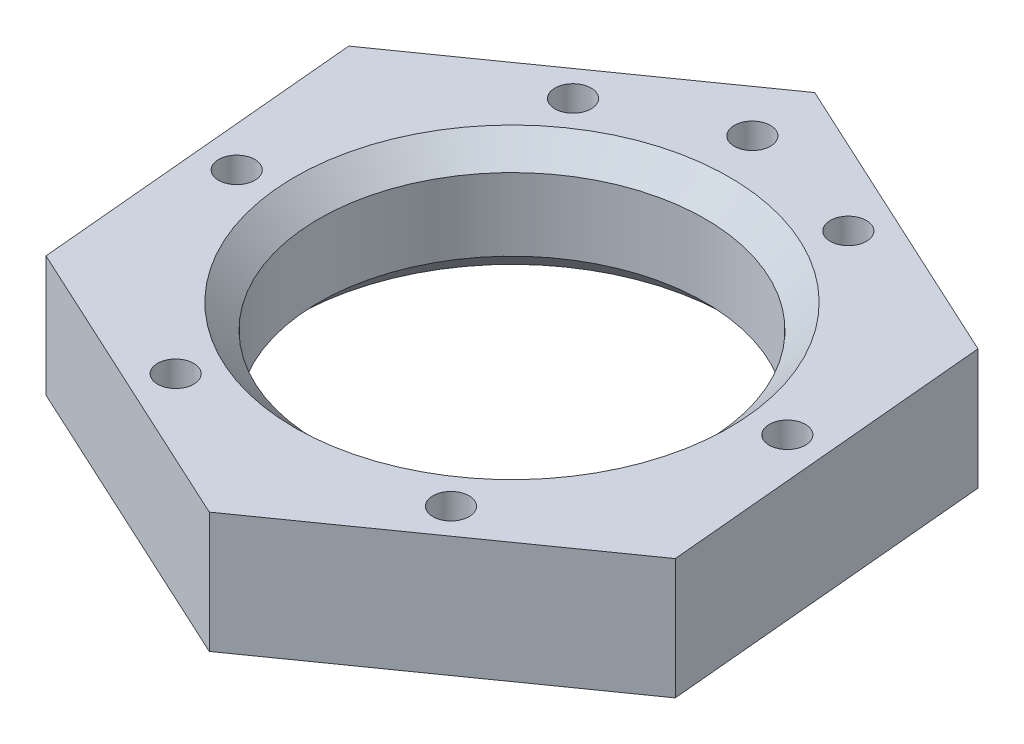
ISO-10303-21;
HEADER;
FILE_DESCRIPTION(('STEP AP214'),'2;1');
FILE_NAME('part.step','',(''),(''),'','','');
FILE_SCHEMA(('AUTOMOTIVE_DESIGN { 1 0 10303 214 1 1 1 1 }'));
ENDSEC;
DATA;
#1=APPLICATION_CONTEXT('core data for automotive mechanical design processes');
#2=APPLICATION_PROTOCOL_DEFINITION('international standard','automotive_design',2000,#1);
#3=PRODUCT_CONTEXT('',#1,'mechanical');
#4=PRODUCT('Part','Part','',(#3));
#5=PRODUCT_RELATED_PRODUCT_CATEGORY('part','',(#4));
#6=PRODUCT_DEFINITION_FORMATION('','',#4);
#7=PRODUCT_DEFINITION_CONTEXT('part definition',#1,'design');
#8=PRODUCT_DEFINITION('design','',#6,#7);
#9=PRODUCT_DEFINITION_SHAPE('','',#8);
#10=(LENGTH_UNIT() NAMED_UNIT(*) SI_UNIT(.MILLI.,.METRE.));
#11=(NAMED_UNIT(*) PLANE_ANGLE_UNIT() SI_UNIT($,.RADIAN.));
#12=(NAMED_UNIT(*) SI_UNIT($,.STERADIAN.) SOLID_ANGLE_UNIT());
#13=UNCERTAINTY_MEASURE_WITH_UNIT(LENGTH_MEASURE(1.E-05),#10,'distance_accuracy_value','');
#14=(GEOMETRIC_REPRESENTATION_CONTEXT(3) GLOBAL_UNCERTAINTY_ASSIGNED_CONTEXT((#13)) GLOBAL_UNIT_ASSIGNED_CONTEXT((#10,
#11,#12)) REPRESENTATION_CONTEXT('',''));
#15=CARTESIAN_POINT('',(0.,0.,0.));
#16=DIRECTION('',(0.,0.,1.));
#17=DIRECTION('',(1.,0.,0.));
#18=AXIS2_PLACEMENT_3D('',#15,#16,#17);
#19=CARTESIAN_POINT('',(-14.3804089631958,6.35,10.1430093192917));
#20=DIRECTION('',(0.419504911530997,0.,-0.907753066203233));
#21=DIRECTION('',(-0.907753066203233,0.,-0.419504911530997));
#22=AXIS2_PLACEMENT_3D('',#19,#20,#21);
#23=PLANE('',#22);
#24=DIRECTION('',(0.907753066203232,0.,0.419504911530997));
#25=VECTOR('',#24,1.);
#26=CARTESIAN_POINT('',(-14.3804089631958,0.,10.1430093192917));
#27=LINE('',#26,#25);
#28=CARTESIAN_POINT('',(-14.3804089631958,0.,10.1430093192917));
#29=VERTEX_POINT('',#28);
#30=CARTESIAN_POINT('',(1.59389925973101,0.,17.5253041385828));
#31=VERTEX_POINT('',#30);
#32=EDGE_CURVE('E119',#29,#31,#27,.T.);
#33=ORIENTED_EDGE('',*,*,#32,.T.);
#34=DIRECTION('',(0.,-1.,0.));
#35=VECTOR('',#34,1.);
#36=CARTESIAN_POINT('',(1.59389925973101,6.35,17.5253041385828));
#37=LINE('',#36,#35);
#38=CARTESIAN_POINT('',(1.59389925973101,6.35,17.5253041385828));
#39=VERTEX_POINT('',#38);
#40=EDGE_CURVE('E137',#39,#31,#37,.T.);
#41=ORIENTED_EDGE('',*,*,#40,.F.);
#42=DIRECTION('',(0.907753066203232,0.,0.419504911530997));
#43=VECTOR('',#42,1.);
#44=CARTESIAN_POINT('',(-14.3804089631958,6.35,10.1430093192917));
#45=LINE('',#44,#43);
#46=CARTESIAN_POINT('',(-14.3804089631958,6.35,10.1430093192917));
#47=VERTEX_POINT('',#46);
#48=EDGE_CURVE('E130',#47,#39,#45,.T.);
#49=ORIENTED_EDGE('',*,*,#48,.F.);
#50=DIRECTION('',(0.,-1.,0.));
#51=VECTOR('',#50,1.);
#52=CARTESIAN_POINT('',(-14.3804089631958,6.35,10.1430093192917));
#53=LINE('',#52,#51);
#54=EDGE_CURVE('E115',#47,#29,#53,.T.);
#55=ORIENTED_EDGE('',*,*,#54,.T.);
#56=EDGE_LOOP('',(#33,#41,#49,#55));
#57=FACE_BOUND('',#56,.T.);
#58=ADVANCED_FACE('F33',(#57),#23,.F.);
#59=CARTESIAN_POINT('',(1.59389925973101,6.35,17.5253041385828));
#60=DIRECTION('',(-0.576384759929718,0.,-0.817178443499803));
#61=DIRECTION('',(-0.817178443499803,0.,0.576384759929718));
#62=AXIS2_PLACEMENT_3D('',#59,#60,#61);
#63=PLANE('',#62);
#64=DIRECTION('',(0.817178443499803,0.,-0.576384759929718));
#65=VECTOR('',#64,1.);
#66=CARTESIAN_POINT('',(1.59389925973101,0.,17.5253041385828));
#67=LINE('',#66,#65);
#68=CARTESIAN_POINT('',(15.9743082229268,0.,7.38229481929115));
#69=VERTEX_POINT('',#68);
#70=EDGE_CURVE('E122',#31,#69,#67,.T.);
#71=ORIENTED_EDGE('',*,*,#70,.T.);
#72=DIRECTION('',(0.,-1.,0.));
#73=VECTOR('',#72,1.);
#74=CARTESIAN_POINT('',(15.9743082229268,6.35,7.38229481929115));
#75=LINE('',#74,#73);
#76=CARTESIAN_POINT('',(15.9743082229268,6.35,7.38229481929115));
#77=VERTEX_POINT('',#76);
#78=EDGE_CURVE('E134',#77,#69,#75,.T.);
#79=ORIENTED_EDGE('',*,*,#78,.F.);
#80=DIRECTION('',(0.817178443499803,0.,-0.576384759929718));
#81=VECTOR('',#80,1.);
#82=CARTESIAN_POINT('',(1.59389925973101,6.35,17.5253041385828));
#83=LINE('',#82,#81);
#84=EDGE_CURVE('E88',#39,#77,#83,.T.);
#85=ORIENTED_EDGE('',*,*,#84,.F.);
#86=ORIENTED_EDGE('',*,*,#40,.T.);
#87=EDGE_LOOP('',(#71,#79,#85,#86));
#88=FACE_BOUND('',#87,.T.);
#89=ADVANCED_FACE('F176',(#88),#63,.F.);
#90=CARTESIAN_POINT('',(15.9743082229268,6.35,7.38229481929115));
#91=DIRECTION('',(-0.995889671460715,0.,0.0905746227034295));
#92=DIRECTION('',(0.0905746227034295,0.,0.995889671460715));
#93=AXIS2_PLACEMENT_3D('',#90,#91,#92);
#94=PLANE('',#93);
#95=DIRECTION('',(-0.0905746227034295,0.,-0.995889671460715));
#96=VECTOR('',#95,1.);
#97=CARTESIAN_POINT('',(15.9743082229268,0.,7.38229481929115));
#98=LINE('',#97,#96);
#99=CARTESIAN_POINT('',(14.3804089631958,0.,-10.1430093192917));
#100=VERTEX_POINT('',#99);
#101=EDGE_CURVE('E125',#69,#100,#98,.T.);
#102=ORIENTED_EDGE('',*,*,#101,.T.);
#103=DIRECTION('',(0.,-1.,0.));
#104=VECTOR('',#103,1.);
#105=CARTESIAN_POINT('',(14.3804089631958,6.35,-10.1430093192917));
#106=LINE('',#105,#104);
#107=CARTESIAN_POINT('',(14.3804089631958,6.35,-10.1430093192917));
#108=VERTEX_POINT('',#107);
#109=EDGE_CURVE('E110',#108,#100,#106,.T.);
#110=ORIENTED_EDGE('',*,*,#109,.F.);
#111=DIRECTION('',(-0.0905746227034295,0.,-0.995889671460715));
#112=VECTOR('',#111,1.);
#113=CARTESIAN_POINT('',(15.9743082229268,6.35,7.38229481929115));
#114=LINE('',#113,#112);
#115=EDGE_CURVE('E101',#77,#108,#114,.T.);
#116=ORIENTED_EDGE('',*,*,#115,.F.);
#117=ORIENTED_EDGE('',*,*,#78,.T.);
#118=EDGE_LOOP('',(#102,#110,#116,#117));
#119=FACE_BOUND('',#118,.T.);
#120=ADVANCED_FACE('F181',(#119),#94,.F.);
#121=CARTESIAN_POINT('',(14.3804089631958,6.35,-10.1430093192917));
#122=DIRECTION('',(-0.419504911530997,0.,0.907753066203233));
#123=DIRECTION('',(0.907753066203233,0.,0.419504911530997));
#124=AXIS2_PLACEMENT_3D('',#121,#122,#123);
#125=PLANE('',#124);
#126=DIRECTION('',(-0.907753066203232,0.,-0.419504911530997));
#127=VECTOR('',#126,1.);
#128=CARTESIAN_POINT('',(14.3804089631958,0.,-10.1430093192917));
#129=LINE('',#128,#127);
#130=CARTESIAN_POINT('',(-1.59389925973101,0.,-17.5253041385828));
#131=VERTEX_POINT('',#130);
#132=EDGE_CURVE('E109',#100,#131,#129,.T.);
#133=ORIENTED_EDGE('',*,*,#132,.T.);
#134=DIRECTION('',(0.,-1.,0.));
#135=VECTOR('',#134,1.);
#136=CARTESIAN_POINT('',(-1.59389925973101,6.35,-17.5253041385828));
#137=LINE('',#136,#135);
#138=CARTESIAN_POINT('',(-1.59389925973101,6.35,-17.5253041385828));
#139=VERTEX_POINT('',#138);
#140=EDGE_CURVE('E106',#139,#131,#137,.T.);
#141=ORIENTED_EDGE('',*,*,#140,.F.);
#142=DIRECTION('',(-0.907753066203232,0.,-0.419504911530997));
#143=VECTOR('',#142,1.);
#144=CARTESIAN_POINT('',(14.3804089631958,6.35,-10.1430093192917));
#145=LINE('',#144,#143);
#146=EDGE_CURVE('E95',#108,#139,#145,.T.);
#147=ORIENTED_EDGE('',*,*,#146,.F.);
#148=ORIENTED_EDGE('',*,*,#109,.T.);
#149=EDGE_LOOP('',(#133,#141,#147,#148));
#150=FACE_BOUND('',#149,.T.);
#151=ADVANCED_FACE('F107',(#150),#125,.F.);
#152=CARTESIAN_POINT('',(-1.59389925973101,6.35,-17.5253041385828));
#153=DIRECTION('',(0.576384759929718,0.,0.817178443499803));
#154=DIRECTION('',(0.817178443499803,0.,-0.576384759929718));
#155=AXIS2_PLACEMENT_3D('',#152,#153,#154);
#156=PLANE('',#155);
#157=DIRECTION('',(-0.817178443499803,0.,0.576384759929718));
#158=VECTOR('',#157,1.);
#159=CARTESIAN_POINT('',(-1.59389925973101,0.,-17.5253041385828));
#160=LINE('',#159,#158);
#161=CARTESIAN_POINT('',(-15.9743082229268,0.,-7.38229481929115));
#162=VERTEX_POINT('',#161);
#163=EDGE_CURVE('E73',#131,#162,#160,.T.);
#164=ORIENTED_EDGE('',*,*,#163,.T.);
#165=DIRECTION('',(0.,-1.,0.));
#166=VECTOR('',#165,1.);
#167=CARTESIAN_POINT('',(-15.9743082229268,6.35,-7.38229481929115));
#168=LINE('',#167,#166);
#169=CARTESIAN_POINT('',(-15.9743082229268,6.35,-7.38229481929115));
#170=VERTEX_POINT('',#169);
#171=EDGE_CURVE('E111',#170,#162,#168,.T.);
#172=ORIENTED_EDGE('',*,*,#171,.F.);
#173=DIRECTION('',(-0.817178443499803,0.,0.576384759929718));
#174=VECTOR('',#173,1.);
#175=CARTESIAN_POINT('',(-1.59389925973101,6.35,-17.5253041385828));
#176=LINE('',#175,#174);
#177=EDGE_CURVE('E99',#139,#170,#176,.T.);
#178=ORIENTED_EDGE('',*,*,#177,.F.);
#179=ORIENTED_EDGE('',*,*,#140,.T.);
#180=EDGE_LOOP('',(#164,#172,#178,#179));
#181=FACE_BOUND('',#180,.T.);
#182=ADVANCED_FACE('F113',(#181),#156,.F.);
#183=CARTESIAN_POINT('',(-15.9743082229268,6.35,-7.38229481929115));
#184=DIRECTION('',(0.995889671460715,0.,-0.0905746227034294));
#185=DIRECTION('',(-0.0905746227034294,0.,-0.995889671460715));
#186=AXIS2_PLACEMENT_3D('',#183,#184,#185);
#187=PLANE('',#186);
#188=DIRECTION('',(0.0905746227034294,0.,0.995889671460715));
#189=VECTOR('',#188,1.);
#190=CARTESIAN_POINT('',(-15.9743082229268,0.,-7.38229481929115));
#191=LINE('',#190,#189);
#192=EDGE_CURVE('E79',#162,#29,#191,.T.);
#193=ORIENTED_EDGE('',*,*,#192,.T.);
#194=ORIENTED_EDGE('',*,*,#54,.F.);
#195=DIRECTION('',(0.0905746227034294,0.,0.995889671460715));
#196=VECTOR('',#195,1.);
#197=CARTESIAN_POINT('',(-15.9743082229268,6.35,-7.38229481929115));
#198=LINE('',#197,#196);
#199=EDGE_CURVE('E50',#170,#47,#198,.T.);
#200=ORIENTED_EDGE('',*,*,#199,.F.);
#201=ORIENTED_EDGE('',*,*,#171,.T.);
#202=EDGE_LOOP('',(#193,#194,#200,#201));
#203=FACE_BOUND('',#202,.T.);
#204=ADVANCED_FACE('F165',(#203),#187,.F.);
#205=CARTESIAN_POINT('',(0.,6.35,0.));
#206=DIRECTION('',(0.,1.,0.));
#207=DIRECTION('',(0.,0.,1.));
#208=AXIS2_PLACEMENT_3D('',#205,#206,#207);
#209=PLANE('',#208);
#210=CARTESIAN_POINT('',(-13.2801887689279,6.35,1.20781259375056));
#211=DIRECTION('',(0.,1.,0.));
#212=DIRECTION('',(0.,0.,1.));
#213=AXIS2_PLACEMENT_3D('',#210,#211,#212);
#214=CIRCLE('',#213,0.95250000000031);
#215=CARTESIAN_POINT('',(-13.2801887689279,6.35,2.16031259375087));
#216=VERTEX_POINT('',#215);
#217=EDGE_CURVE('E314',#216,#216,#214,.T.);
#218=ORIENTED_EDGE('',*,*,#217,.F.);
#219=EDGE_LOOP('',(#218));
#220=FACE_BOUND('',#219,.T.);
#221=CARTESIAN_POINT('',(-5.59409799526453,6.35,12.10488713782));
#222=DIRECTION('',(0.,1.,0.));
#223=DIRECTION('',(0.,0.,1.));
#224=AXIS2_PLACEMENT_3D('',#221,#222,#223);
#225=CIRCLE('',#224,0.952500000000998);
#226=CARTESIAN_POINT('',(-5.59409799526453,6.35,13.057387137821));
#227=VERTEX_POINT('',#226);
#228=EDGE_CURVE('E316',#227,#227,#225,.T.);
#229=ORIENTED_EDGE('',*,*,#228,.F.);
#230=EDGE_LOOP('',(#229));
#231=FACE_BOUND('',#230,.T.);
#232=CARTESIAN_POINT('',(7.68609077366403,6.35,10.897074544069));
#233=DIRECTION('',(0.,1.,0.));
#234=DIRECTION('',(0.,0.,1.));
#235=AXIS2_PLACEMENT_3D('',#232,#233,#234);
#236=CIRCLE('',#235,0.952500000001527);
#237=CARTESIAN_POINT('',(7.68609077366403,6.35,11.8495745440705));
#238=VERTEX_POINT('',#237);
#239=EDGE_CURVE('E322',#238,#238,#236,.T.);
#240=ORIENTED_EDGE('',*,*,#239,.F.);
#241=EDGE_LOOP('',(#240));
#242=FACE_BOUND('',#241,.T.);
#243=CARTESIAN_POINT('',(13.2801887689292,6.35,-1.20781259375142));
#244=DIRECTION('',(0.,1.,0.));
#245=DIRECTION('',(0.,0.,1.));
#246=AXIS2_PLACEMENT_3D('',#243,#244,#245);
#247=CIRCLE('',#246,0.952500000001344);
#248=CARTESIAN_POINT('',(13.2801887689292,6.35,-0.255312593750081));
#249=VERTEX_POINT('',#248);
#250=EDGE_CURVE('E328',#249,#249,#247,.T.);
#251=ORIENTED_EDGE('',*,*,#250,.F.);
#252=EDGE_LOOP('',(#251));
#253=FACE_BOUND('',#252,.T.);
#254=CARTESIAN_POINT('',(5.59409799526577,6.35,-12.1048871378209));
#255=DIRECTION('',(0.,1.,0.));
#256=DIRECTION('',(0.,0.,1.));
#257=AXIS2_PLACEMENT_3D('',#254,#255,#256);
#258=CIRCLE('',#257,0.952500000000593);
#259=CARTESIAN_POINT('',(5.59409799526577,6.35,-11.1523871378203));
#260=VERTEX_POINT('',#259);
#261=EDGE_CURVE('E334',#260,#260,#258,.T.);
#262=ORIENTED_EDGE('',*,*,#261,.F.);
#263=EDGE_LOOP('',(#262));
#264=FACE_BOUND('',#263,.T.);
#265=CARTESIAN_POINT('',(-1.26532747916691,6.35,-13.9125787103062));
#266=DIRECTION('',(0.,1.,0.));
#267=DIRECTION('',(0.,0.,1.));
#268=AXIS2_PLACEMENT_3D('',#265,#266,#267);
#269=CIRCLE('',#268,0.9525);
#270=CARTESIAN_POINT('',(-1.26532747916691,6.35,-12.9600787103062));
#271=VERTEX_POINT('',#270);
#272=EDGE_CURVE('E340',#271,#271,#269,.T.);
#273=ORIENTED_EDGE('',*,*,#272,.F.);
#274=EDGE_LOOP('',(#273));
#275=FACE_BOUND('',#274,.T.);
#276=CARTESIAN_POINT('',(-7.6860907736628,6.35,-10.8970745440699));
#277=DIRECTION('',(0.,1.,0.));
#278=DIRECTION('',(0.,0.,1.));
#279=AXIS2_PLACEMENT_3D('',#276,#277,#278);
#280=CIRCLE('',#279,0.9525);
#281=CARTESIAN_POINT('',(-7.6860907736628,6.35,-9.94457454406988));
#282=VERTEX_POINT('',#281);
#283=EDGE_CURVE('E346',#282,#282,#280,.T.);
#284=ORIENTED_EDGE('',*,*,#283,.F.);
#285=EDGE_LOOP('',(#284));
#286=FACE_BOUND('',#285,.T.);
#287=CARTESIAN_POINT('',(0.,6.35,0.));
#288=DIRECTION('',(0.,1.,0.));
#289=DIRECTION('',(0.,0.,1.));
#290=AXIS2_PLACEMENT_3D('',#287,#288,#289);
#291=CIRCLE('',#290,11.43);
#292=CARTESIAN_POINT('',(0.,6.35,11.43));
#293=VERTEX_POINT('',#292);
#294=EDGE_CURVE('E11',#293,#293,#291,.F.);
#295=ORIENTED_EDGE('',*,*,#294,.T.);
#296=EDGE_LOOP('',(#295));
#297=FACE_BOUND('',#296,.T.);
#298=ORIENTED_EDGE('',*,*,#48,.T.);
#299=ORIENTED_EDGE('',*,*,#84,.T.);
#300=ORIENTED_EDGE('',*,*,#115,.T.);
#301=ORIENTED_EDGE('',*,*,#146,.T.);
#302=ORIENTED_EDGE('',*,*,#177,.T.);
#303=ORIENTED_EDGE('',*,*,#199,.T.);
#304=EDGE_LOOP('',(#298,#299,#300,#301,#302,#303));
#305=FACE_BOUND('',#304,.T.);
#306=ADVANCED_FACE('F97',(#220,#231,#242,#253,#264,#275,#286,#297,#305),#209,.T.);
#307=CARTESIAN_POINT('',(0.,0.,0.));
#308=DIRECTION('',(0.,1.,0.));
#309=DIRECTION('',(0.,0.,1.));
#310=AXIS2_PLACEMENT_3D('',#307,#308,#309);
#311=PLANE('',#310);
#312=CARTESIAN_POINT('',(-13.2801887689279,0.,1.20781259375056));
#313=DIRECTION('',(0.,1.,0.));
#314=DIRECTION('',(0.,0.,1.));
#315=AXIS2_PLACEMENT_3D('',#312,#313,#314);
#316=CIRCLE('',#315,0.95250000000031);
#317=CARTESIAN_POINT('',(-13.2801887689279,0.,2.16031259375087));
#318=VERTEX_POINT('',#317);
#319=EDGE_CURVE('E311',#318,#318,#316,.T.);
#320=ORIENTED_EDGE('',*,*,#319,.T.);
#321=EDGE_LOOP('',(#320));
#322=FACE_BOUND('',#321,.T.);
#323=CARTESIAN_POINT('',(-5.59409799526453,0.,12.10488713782));
#324=DIRECTION('',(0.,1.,0.));
#325=DIRECTION('',(0.,0.,1.));
#326=AXIS2_PLACEMENT_3D('',#323,#324,#325);
#327=CIRCLE('',#326,0.952500000000998);
#328=CARTESIAN_POINT('',(-5.59409799526453,0.,13.057387137821));
#329=VERTEX_POINT('',#328);
#330=EDGE_CURVE('E319',#329,#329,#327,.T.);
#331=ORIENTED_EDGE('',*,*,#330,.T.);
#332=EDGE_LOOP('',(#331));
#333=FACE_BOUND('',#332,.T.);
#334=CARTESIAN_POINT('',(7.68609077366403,0.,10.897074544069));
#335=DIRECTION('',(0.,1.,0.));
#336=DIRECTION('',(0.,0.,1.));
#337=AXIS2_PLACEMENT_3D('',#334,#335,#336);
#338=CIRCLE('',#337,0.952500000001527);
#339=CARTESIAN_POINT('',(7.68609077366403,0.,11.8495745440705));
#340=VERTEX_POINT('',#339);
#341=EDGE_CURVE('E325',#340,#340,#338,.T.);
#342=ORIENTED_EDGE('',*,*,#341,.T.);
#343=EDGE_LOOP('',(#342));
#344=FACE_BOUND('',#343,.T.);
#345=CARTESIAN_POINT('',(13.2801887689292,0.,-1.20781259375142));
#346=DIRECTION('',(0.,1.,0.));
#347=DIRECTION('',(0.,0.,1.));
#348=AXIS2_PLACEMENT_3D('',#345,#346,#347);
#349=CIRCLE('',#348,0.952500000001344);
#350=CARTESIAN_POINT('',(13.2801887689292,0.,-0.255312593750081));
#351=VERTEX_POINT('',#350);
#352=EDGE_CURVE('E331',#351,#351,#349,.T.);
#353=ORIENTED_EDGE('',*,*,#352,.T.);
#354=EDGE_LOOP('',(#353));
#355=FACE_BOUND('',#354,.T.);
#356=CARTESIAN_POINT('',(5.59409799526577,0.,-12.1048871378209));
#357=DIRECTION('',(0.,1.,0.));
#358=DIRECTION('',(0.,0.,1.));
#359=AXIS2_PLACEMENT_3D('',#356,#357,#358);
#360=CIRCLE('',#359,0.952500000000593);
#361=CARTESIAN_POINT('',(5.59409799526577,0.,-11.1523871378203));
#362=VERTEX_POINT('',#361);
#363=EDGE_CURVE('E337',#362,#362,#360,.T.);
#364=ORIENTED_EDGE('',*,*,#363,.T.);
#365=EDGE_LOOP('',(#364));
#366=FACE_BOUND('',#365,.T.);
#367=CARTESIAN_POINT('',(-1.26532747916691,0.,-13.9125787103062));
#368=DIRECTION('',(0.,1.,0.));
#369=DIRECTION('',(0.,0.,1.));
#370=AXIS2_PLACEMENT_3D('',#367,#368,#369);
#371=CIRCLE('',#370,0.9525);
#372=CARTESIAN_POINT('',(-1.26532747916691,0.,-12.9600787103062));
#373=VERTEX_POINT('',#372);
#374=EDGE_CURVE('E343',#373,#373,#371,.T.);
#375=ORIENTED_EDGE('',*,*,#374,.T.);
#376=EDGE_LOOP('',(#375));
#377=FACE_BOUND('',#376,.T.);
#378=CARTESIAN_POINT('',(-7.6860907736628,0.,-10.8970745440699));
#379=DIRECTION('',(0.,1.,0.));
#380=DIRECTION('',(0.,0.,1.));
#381=AXIS2_PLACEMENT_3D('',#378,#379,#380);
#382=CIRCLE('',#381,0.9525);
#383=CARTESIAN_POINT('',(-7.6860907736628,0.,-9.94457454406988));
#384=VERTEX_POINT('',#383);
#385=EDGE_CURVE('E123',#384,#384,#382,.T.);
#386=ORIENTED_EDGE('',*,*,#385,.T.);
#387=EDGE_LOOP('',(#386));
#388=FACE_BOUND('',#387,.T.);
#389=CARTESIAN_POINT('',(0.,0.,0.));
#390=DIRECTION('',(0.,1.,0.));
#391=DIRECTION('',(0.,0.,1.));
#392=AXIS2_PLACEMENT_3D('',#389,#390,#391);
#393=CIRCLE('',#392,11.43);
#394=CARTESIAN_POINT('',(0.,0.,11.43));
#395=VERTEX_POINT('',#394);
#396=EDGE_CURVE('E139',#395,#395,#393,.T.);
#397=ORIENTED_EDGE('',*,*,#396,.T.);
#398=EDGE_LOOP('',(#397));
#399=FACE_BOUND('',#398,.T.);
#400=ORIENTED_EDGE('',*,*,#32,.F.);
#401=ORIENTED_EDGE('',*,*,#192,.F.);
#402=ORIENTED_EDGE('',*,*,#163,.F.);
#403=ORIENTED_EDGE('',*,*,#132,.F.);
#404=ORIENTED_EDGE('',*,*,#101,.F.);
#405=ORIENTED_EDGE('',*,*,#70,.F.);
#406=EDGE_LOOP('',(#400,#401,#402,#403,#404,#405));
#407=FACE_BOUND('',#406,.T.);
#408=ADVANCED_FACE('F155',(#322,#333,#344,#355,#366,#377,#388,#399,#407),#311,.F.);
#409=CARTESIAN_POINT('',(0.,0.,0.));
#410=DIRECTION('',(0.,1.,0.));
#411=DIRECTION('',(0.,0.,1.));
#412=AXIS2_PLACEMENT_3D('',#409,#410,#411);
#413=CYLINDRICAL_SURFACE('',#412,10.16);
#414=CARTESIAN_POINT('',(0.,1.27000000000001,0.));
#415=DIRECTION('',(0.,1.,0.));
#416=DIRECTION('',(0.,0.,1.));
#417=AXIS2_PLACEMENT_3D('',#414,#415,#416);
#418=CIRCLE('',#417,10.16);
#419=CARTESIAN_POINT('',(0.,1.27000000000001,10.16));
#420=VERTEX_POINT('',#419);
#421=EDGE_CURVE('E42',#420,#420,#418,.F.);
#422=ORIENTED_EDGE('',*,*,#421,.T.);
#423=EDGE_LOOP('',(#422));
#424=FACE_BOUND('',#423,.T.);
#425=CARTESIAN_POINT('',(0.,5.07999999999999,0.));
#426=DIRECTION('',(0.,1.,0.));
#427=DIRECTION('',(0.,0.,1.));
#428=AXIS2_PLACEMENT_3D('',#425,#426,#427);
#429=CIRCLE('',#428,10.16);
#430=CARTESIAN_POINT('',(0.,5.07999999999999,10.16));
#431=VERTEX_POINT('',#430);
#432=EDGE_CURVE('E142',#431,#431,#429,.T.);
#433=ORIENTED_EDGE('',*,*,#432,.T.);
#434=EDGE_LOOP('',(#433));
#435=FACE_BOUND('',#434,.T.);
#436=ADVANCED_FACE('F147',(#424,#435),#413,.F.);
#437=CARTESIAN_POINT('',(0.,0.,0.));
#438=DIRECTION('',(0.,-1.,0.));
#439=DIRECTION('',(0.,0.,-1.));
#440=AXIS2_PLACEMENT_3D('',#437,#438,#439);
#441=CONICAL_SURFACE('',#440,11.43,0.785398163397445);
#442=ORIENTED_EDGE('',*,*,#421,.F.);
#443=EDGE_LOOP('',(#442));
#444=FACE_BOUND('',#443,.T.);
#445=ORIENTED_EDGE('',*,*,#396,.F.);
#446=EDGE_LOOP('',(#445));
#447=FACE_BOUND('',#446,.T.);
#448=ADVANCED_FACE('F150',(#444,#447),#441,.F.);
#449=CARTESIAN_POINT('',(0.,5.07999999999999,0.));
#450=DIRECTION('',(0.,1.,0.));
#451=DIRECTION('',(0.,0.,1.));
#452=AXIS2_PLACEMENT_3D('',#449,#450,#451);
#453=CONICAL_SURFACE('',#452,10.16,0.785398163397451);
#454=ORIENTED_EDGE('',*,*,#294,.F.);
#455=EDGE_LOOP('',(#454));
#456=FACE_BOUND('',#455,.T.);
#457=ORIENTED_EDGE('',*,*,#432,.F.);
#458=EDGE_LOOP('',(#457));
#459=FACE_BOUND('',#458,.T.);
#460=ADVANCED_FACE('F35',(#456,#459),#453,.F.);
#461=CARTESIAN_POINT('',(-7.6860907736628,0.,-10.8970745440699));
#462=DIRECTION('',(0.,1.,0.));
#463=DIRECTION('',(0.,0.,1.));
#464=AXIS2_PLACEMENT_3D('',#461,#462,#463);
#465=CYLINDRICAL_SURFACE('',#464,0.9525);
#466=ORIENTED_EDGE('',*,*,#385,.F.);
#467=EDGE_LOOP('',(#466));
#468=FACE_BOUND('',#467,.T.);
#469=ORIENTED_EDGE('',*,*,#283,.T.);
#470=EDGE_LOOP('',(#469));
#471=FACE_BOUND('',#470,.T.);
#472=ADVANCED_FACE('F225',(#468,#471),#465,.F.);
#473=CARTESIAN_POINT('',(-1.26532747916691,0.,-13.9125787103062));
#474=DIRECTION('',(0.,1.,0.));
#475=DIRECTION('',(0.,0.,1.));
#476=AXIS2_PLACEMENT_3D('',#473,#474,#475);
#477=CYLINDRICAL_SURFACE('',#476,0.9525);
#478=ORIENTED_EDGE('',*,*,#374,.F.);
#479=EDGE_LOOP('',(#478));
#480=FACE_BOUND('',#479,.T.);
#481=ORIENTED_EDGE('',*,*,#272,.T.);
#482=EDGE_LOOP('',(#481));
#483=FACE_BOUND('',#482,.T.);
#484=ADVANCED_FACE('F244',(#480,#483),#477,.F.);
#485=CARTESIAN_POINT('',(5.59409799526577,0.,-12.1048871378209));
#486=DIRECTION('',(0.,1.,0.));
#487=DIRECTION('',(0.,0.,1.));
#488=AXIS2_PLACEMENT_3D('',#485,#486,#487);
#489=CYLINDRICAL_SURFACE('',#488,0.952500000000593);
#490=ORIENTED_EDGE('',*,*,#363,.F.);
#491=EDGE_LOOP('',(#490));
#492=FACE_BOUND('',#491,.T.);
#493=ORIENTED_EDGE('',*,*,#261,.T.);
#494=EDGE_LOOP('',(#493));
#495=FACE_BOUND('',#494,.T.);
#496=ADVANCED_FACE('F254',(#492,#495),#489,.F.);
#497=CARTESIAN_POINT('',(13.2801887689292,0.,-1.20781259375142));
#498=DIRECTION('',(0.,1.,0.));
#499=DIRECTION('',(0.,0.,1.));
#500=AXIS2_PLACEMENT_3D('',#497,#498,#499);
#501=CYLINDRICAL_SURFACE('',#500,0.952500000001344);
#502=ORIENTED_EDGE('',*,*,#352,.F.);
#503=EDGE_LOOP('',(#502));
#504=FACE_BOUND('',#503,.T.);
#505=ORIENTED_EDGE('',*,*,#250,.T.);
#506=EDGE_LOOP('',(#505));
#507=FACE_BOUND('',#506,.T.);
#508=ADVANCED_FACE('F264',(#504,#507),#501,.F.);
#509=CARTESIAN_POINT('',(7.68609077366403,0.,10.897074544069));
#510=DIRECTION('',(0.,1.,0.));
#511=DIRECTION('',(0.,0.,1.));
#512=AXIS2_PLACEMENT_3D('',#509,#510,#511);
#513=CYLINDRICAL_SURFACE('',#512,0.952500000001527);
#514=ORIENTED_EDGE('',*,*,#341,.F.);
#515=EDGE_LOOP('',(#514));
#516=FACE_BOUND('',#515,.T.);
#517=ORIENTED_EDGE('',*,*,#239,.T.);
#518=EDGE_LOOP('',(#517));
#519=FACE_BOUND('',#518,.T.);
#520=ADVANCED_FACE('F274',(#516,#519),#513,.F.);
#521=CARTESIAN_POINT('',(-5.59409799526453,0.,12.10488713782));
#522=DIRECTION('',(0.,1.,0.));
#523=DIRECTION('',(0.,0.,1.));
#524=AXIS2_PLACEMENT_3D('',#521,#522,#523);
#525=CYLINDRICAL_SURFACE('',#524,0.952500000000998);
#526=ORIENTED_EDGE('',*,*,#330,.F.);
#527=EDGE_LOOP('',(#526));
#528=FACE_BOUND('',#527,.T.);
#529=ORIENTED_EDGE('',*,*,#228,.T.);
#530=EDGE_LOOP('',(#529));
#531=FACE_BOUND('',#530,.T.);
#532=ADVANCED_FACE('F284',(#528,#531),#525,.F.);
#533=CARTESIAN_POINT('',(-13.2801887689279,0.,1.20781259375056));
#534=DIRECTION('',(0.,1.,0.));
#535=DIRECTION('',(0.,0.,1.));
#536=AXIS2_PLACEMENT_3D('',#533,#534,#535);
#537=CYLINDRICAL_SURFACE('',#536,0.95250000000031);
#538=ORIENTED_EDGE('',*,*,#319,.F.);
#539=EDGE_LOOP('',(#538));
#540=FACE_BOUND('',#539,.T.);
#541=ORIENTED_EDGE('',*,*,#217,.T.);
#542=EDGE_LOOP('',(#541));
#543=FACE_BOUND('',#542,.T.);
#544=ADVANCED_FACE('F294',(#540,#543),#537,.F.);
#545=CLOSED_SHELL('',(#58,#89,#120,#151,#182,#204,#306,#408,#436,#448,#460,#472,#484,#496,#508,
#520,#532,#544));
#546=MANIFOLD_SOLID_BREP('B2',#545);
#547=ADVANCED_BREP_SHAPE_REPRESENTATION('',(#18,#546),#14);
#548=SHAPE_DEFINITION_REPRESENTATION(#9,#547);
ENDSEC;
END-ISO-10303-21;
